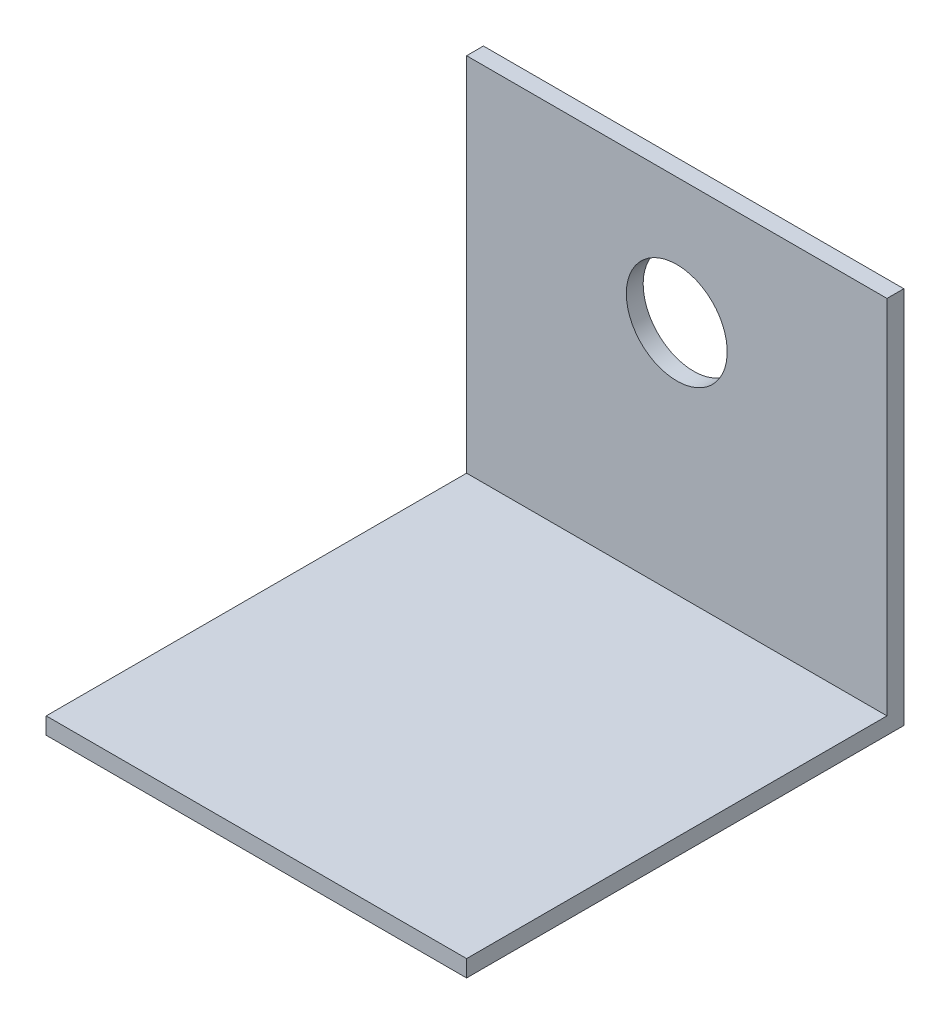
ISO-10303-21;
HEADER;
FILE_DESCRIPTION(('STEP AP214'),'2;1');
FILE_NAME('part.step','',(''),(''),'','','');
FILE_SCHEMA(('AUTOMOTIVE_DESIGN { 1 0 10303 214 1 1 1 1 }'));
ENDSEC;
DATA;
#1=APPLICATION_CONTEXT('core data for automotive mechanical design processes');
#2=APPLICATION_PROTOCOL_DEFINITION('international standard','automotive_design',2000,#1);
#3=PRODUCT_CONTEXT('',#1,'mechanical');
#4=PRODUCT('Part','Part','',(#3));
#5=PRODUCT_RELATED_PRODUCT_CATEGORY('part','',(#4));
#6=PRODUCT_DEFINITION_FORMATION('','',#4);
#7=PRODUCT_DEFINITION_CONTEXT('part definition',#1,'design');
#8=PRODUCT_DEFINITION('design','',#6,#7);
#9=PRODUCT_DEFINITION_SHAPE('','',#8);
#10=(LENGTH_UNIT() NAMED_UNIT(*) SI_UNIT(.MILLI.,.METRE.));
#11=(NAMED_UNIT(*) PLANE_ANGLE_UNIT() SI_UNIT($,.RADIAN.));
#12=(NAMED_UNIT(*) SI_UNIT($,.STERADIAN.) SOLID_ANGLE_UNIT());
#13=UNCERTAINTY_MEASURE_WITH_UNIT(LENGTH_MEASURE(1.E-05),#10,'distance_accuracy_value','');
#14=(GEOMETRIC_REPRESENTATION_CONTEXT(3) GLOBAL_UNCERTAINTY_ASSIGNED_CONTEXT((#13)) GLOBAL_UNIT_ASSIGNED_CONTEXT((#10,
#11,#12)) REPRESENTATION_CONTEXT('',''));
#15=CARTESIAN_POINT('',(0.,0.,0.));
#16=DIRECTION('',(0.,0.,1.));
#17=DIRECTION('',(1.,0.,0.));
#18=AXIS2_PLACEMENT_3D('',#15,#16,#17);
#19=CARTESIAN_POINT('',(0.,2.,0.));
#20=DIRECTION('',(1.,0.,0.));
#21=DIRECTION('',(0.,0.,-1.));
#22=AXIS2_PLACEMENT_3D('',#19,#20,#21);
#23=PLANE('',#22);
#24=DIRECTION('',(0.,0.,1.));
#25=VECTOR('',#24,1.);
#26=CARTESIAN_POINT('',(0.,0.,0.));
#27=LINE('',#26,#25);
#28=CARTESIAN_POINT('',(0.,0.,-2.));
#29=VERTEX_POINT('',#28);
#30=CARTESIAN_POINT('',(0.,0.,50.));
#31=VERTEX_POINT('',#30);
#32=EDGE_CURVE('E94',#29,#31,#27,.T.);
#33=ORIENTED_EDGE('',*,*,#32,.T.);
#34=DIRECTION('',(0.,-1.,0.));
#35=VECTOR('',#34,1.);
#36=CARTESIAN_POINT('',(0.,2.,50.));
#37=LINE('',#36,#35);
#38=CARTESIAN_POINT('',(0.,2.,50.));
#39=VERTEX_POINT('',#38);
#40=EDGE_CURVE('E11',#39,#31,#37,.T.);
#41=ORIENTED_EDGE('',*,*,#40,.F.);
#42=DIRECTION('',(0.,0.,1.));
#43=VECTOR('',#42,1.);
#44=CARTESIAN_POINT('',(0.,2.,0.));
#45=LINE('',#44,#43);
#46=CARTESIAN_POINT('',(0.,2.,0.));
#47=VERTEX_POINT('',#46);
#48=EDGE_CURVE('E86',#47,#39,#45,.T.);
#49=ORIENTED_EDGE('',*,*,#48,.F.);
#50=DIRECTION('',(0.,1.,0.));
#51=VECTOR('',#50,1.);
#52=CARTESIAN_POINT('',(0.,0.,0.));
#53=LINE('',#52,#51);
#54=CARTESIAN_POINT('',(0.,45.,0.));
#55=VERTEX_POINT('',#54);
#56=EDGE_CURVE('E48',#47,#55,#53,.T.);
#57=ORIENTED_EDGE('',*,*,#56,.T.);
#58=DIRECTION('',(0.,0.,1.));
#59=VECTOR('',#58,1.);
#60=CARTESIAN_POINT('',(0.,45.,-2.));
#61=LINE('',#60,#59);
#62=CARTESIAN_POINT('',(0.,45.,-2.));
#63=VERTEX_POINT('',#62);
#64=EDGE_CURVE('E101',#63,#55,#61,.T.);
#65=ORIENTED_EDGE('',*,*,#64,.F.);
#66=DIRECTION('',(0.,1.,0.));
#67=VECTOR('',#66,1.);
#68=CARTESIAN_POINT('',(0.,0.,-2.));
#69=LINE('',#68,#67);
#70=EDGE_CURVE('E98',#29,#63,#69,.T.);
#71=ORIENTED_EDGE('',*,*,#70,.F.);
#72=EDGE_LOOP('',(#33,#41,#49,#57,#65,#71));
#73=FACE_BOUND('',#72,.T.);
#74=ADVANCED_FACE('F32',(#73),#23,.F.);
#75=CARTESIAN_POINT('',(0.,2.,50.));
#76=DIRECTION('',(0.,0.,-1.));
#77=DIRECTION('',(-1.,0.,0.));
#78=AXIS2_PLACEMENT_3D('',#75,#76,#77);
#79=PLANE('',#78);
#80=DIRECTION('',(1.,0.,0.));
#81=VECTOR('',#80,1.);
#82=CARTESIAN_POINT('',(0.,0.,50.));
#83=LINE('',#82,#81);
#84=CARTESIAN_POINT('',(50.,0.,50.));
#85=VERTEX_POINT('',#84);
#86=EDGE_CURVE('E61',#31,#85,#83,.T.);
#87=ORIENTED_EDGE('',*,*,#86,.T.);
#88=DIRECTION('',(0.,-1.,0.));
#89=VECTOR('',#88,1.);
#90=CARTESIAN_POINT('',(50.,2.,50.));
#91=LINE('',#90,#89);
#92=CARTESIAN_POINT('',(50.,2.,50.));
#93=VERTEX_POINT('',#92);
#94=EDGE_CURVE('E40',#93,#85,#91,.T.);
#95=ORIENTED_EDGE('',*,*,#94,.F.);
#96=DIRECTION('',(1.,0.,0.));
#97=VECTOR('',#96,1.);
#98=CARTESIAN_POINT('',(0.,2.,50.));
#99=LINE('',#98,#97);
#100=EDGE_CURVE('E76',#39,#93,#99,.T.);
#101=ORIENTED_EDGE('',*,*,#100,.F.);
#102=ORIENTED_EDGE('',*,*,#40,.T.);
#103=EDGE_LOOP('',(#87,#95,#101,#102));
#104=FACE_BOUND('',#103,.T.);
#105=ADVANCED_FACE('F78',(#104),#79,.F.);
#106=CARTESIAN_POINT('',(50.,2.,0.));
#107=DIRECTION('',(-1.,0.,0.));
#108=DIRECTION('',(0.,0.,1.));
#109=AXIS2_PLACEMENT_3D('',#106,#107,#108);
#110=PLANE('',#109);
#111=DIRECTION('',(0.,0.,-1.));
#112=VECTOR('',#111,1.);
#113=CARTESIAN_POINT('',(50.,0.,0.));
#114=LINE('',#113,#112);
#115=CARTESIAN_POINT('',(50.,0.,-2.));
#116=VERTEX_POINT('',#115);
#117=EDGE_CURVE('E91',#85,#116,#114,.T.);
#118=ORIENTED_EDGE('',*,*,#117,.T.);
#119=DIRECTION('',(0.,-1.,0.));
#120=VECTOR('',#119,1.);
#121=CARTESIAN_POINT('',(50.,0.,-2.));
#122=LINE('',#121,#120);
#123=CARTESIAN_POINT('',(50.,45.,-2.));
#124=VERTEX_POINT('',#123);
#125=EDGE_CURVE('E119',#124,#116,#122,.T.);
#126=ORIENTED_EDGE('',*,*,#125,.F.);
#127=DIRECTION('',(0.,0.,1.));
#128=VECTOR('',#127,1.);
#129=CARTESIAN_POINT('',(50.,45.,-2.));
#130=LINE('',#129,#128);
#131=CARTESIAN_POINT('',(50.,45.,0.));
#132=VERTEX_POINT('',#131);
#133=EDGE_CURVE('E105',#124,#132,#130,.T.);
#134=ORIENTED_EDGE('',*,*,#133,.T.);
#135=DIRECTION('',(0.,-1.,0.));
#136=VECTOR('',#135,1.);
#137=CARTESIAN_POINT('',(50.,0.,0.));
#138=LINE('',#137,#136);
#139=CARTESIAN_POINT('',(50.,2.,0.));
#140=VERTEX_POINT('',#139);
#141=EDGE_CURVE('E121',#132,#140,#138,.T.);
#142=ORIENTED_EDGE('',*,*,#141,.T.);
#143=DIRECTION('',(0.,0.,-1.));
#144=VECTOR('',#143,1.);
#145=CARTESIAN_POINT('',(50.,2.,0.));
#146=LINE('',#145,#144);
#147=EDGE_CURVE('E85',#93,#140,#146,.T.);
#148=ORIENTED_EDGE('',*,*,#147,.F.);
#149=ORIENTED_EDGE('',*,*,#94,.T.);
#150=EDGE_LOOP('',(#118,#126,#134,#142,#148,#149));
#151=FACE_BOUND('',#150,.T.);
#152=ADVANCED_FACE('F159',(#151),#110,.F.);
#153=CARTESIAN_POINT('',(0.,2.,0.));
#154=DIRECTION('',(0.,1.,0.));
#155=DIRECTION('',(0.,0.,1.));
#156=AXIS2_PLACEMENT_3D('',#153,#154,#155);
#157=PLANE('',#156);
#158=ORIENTED_EDGE('',*,*,#48,.T.);
#159=ORIENTED_EDGE('',*,*,#100,.T.);
#160=ORIENTED_EDGE('',*,*,#147,.T.);
#161=DIRECTION('',(-1.,0.,0.));
#162=VECTOR('',#161,1.);
#163=CARTESIAN_POINT('',(0.,2.,0.));
#164=LINE('',#163,#162);
#165=EDGE_CURVE('E65',#140,#47,#164,.T.);
#166=ORIENTED_EDGE('',*,*,#165,.T.);
#167=EDGE_LOOP('',(#158,#159,#160,#166));
#168=FACE_BOUND('',#167,.T.);
#169=ADVANCED_FACE('F89',(#168),#157,.T.);
#170=CARTESIAN_POINT('',(0.,0.,0.));
#171=DIRECTION('',(0.,1.,0.));
#172=DIRECTION('',(0.,0.,1.));
#173=AXIS2_PLACEMENT_3D('',#170,#171,#172);
#174=PLANE('',#173);
#175=ORIENTED_EDGE('',*,*,#32,.F.);
#176=DIRECTION('',(-1.,0.,0.));
#177=VECTOR('',#176,1.);
#178=CARTESIAN_POINT('',(50.,0.,-2.));
#179=LINE('',#178,#177);
#180=EDGE_CURVE('E126',#116,#29,#179,.T.);
#181=ORIENTED_EDGE('',*,*,#180,.F.);
#182=ORIENTED_EDGE('',*,*,#117,.F.);
#183=ORIENTED_EDGE('',*,*,#86,.F.);
#184=EDGE_LOOP('',(#175,#181,#182,#183));
#185=FACE_BOUND('',#184,.T.);
#186=ADVANCED_FACE('F151',(#185),#174,.F.);
#187=CARTESIAN_POINT('',(0.,0.,0.));
#188=DIRECTION('',(0.,0.,1.));
#189=DIRECTION('',(1.,0.,0.));
#190=AXIS2_PLACEMENT_3D('',#187,#188,#189);
#191=PLANE('',#190);
#192=CARTESIAN_POINT('',(25.,30.,0.));
#193=DIRECTION('',(0.,0.,-1.));
#194=DIRECTION('',(-1.,0.,0.));
#195=AXIS2_PLACEMENT_3D('',#192,#193,#194);
#196=CIRCLE('',#195,6.);
#197=CARTESIAN_POINT('',(19.,30.,0.));
#198=VERTEX_POINT('',#197);
#199=EDGE_CURVE('E130',#198,#198,#196,.T.);
#200=ORIENTED_EDGE('',*,*,#199,.T.);
#201=EDGE_LOOP('',(#200));
#202=FACE_BOUND('',#201,.T.);
#203=ORIENTED_EDGE('',*,*,#165,.F.);
#204=ORIENTED_EDGE('',*,*,#141,.F.);
#205=DIRECTION('',(1.,0.,0.));
#206=VECTOR('',#205,1.);
#207=CARTESIAN_POINT('',(50.,45.,0.));
#208=LINE('',#207,#206);
#209=EDGE_CURVE('E116',#55,#132,#208,.T.);
#210=ORIENTED_EDGE('',*,*,#209,.F.);
#211=ORIENTED_EDGE('',*,*,#56,.F.);
#212=EDGE_LOOP('',(#203,#204,#210,#211));
#213=FACE_BOUND('',#212,.T.);
#214=ADVANCED_FACE('F142',(#202,#213),#191,.T.);
#215=CARTESIAN_POINT('',(0.,0.,-2.));
#216=DIRECTION('',(0.,0.,1.));
#217=DIRECTION('',(1.,0.,0.));
#218=AXIS2_PLACEMENT_3D('',#215,#216,#217);
#219=PLANE('',#218);
#220=ORIENTED_EDGE('',*,*,#125,.T.);
#221=ORIENTED_EDGE('',*,*,#180,.T.);
#222=ORIENTED_EDGE('',*,*,#70,.T.);
#223=DIRECTION('',(1.,0.,0.));
#224=VECTOR('',#223,1.);
#225=CARTESIAN_POINT('',(50.,45.,-2.));
#226=LINE('',#225,#224);
#227=EDGE_CURVE('E115',#63,#124,#226,.T.);
#228=ORIENTED_EDGE('',*,*,#227,.T.);
#229=EDGE_LOOP('',(#220,#221,#222,#228));
#230=FACE_BOUND('',#229,.T.);
#231=CARTESIAN_POINT('',(25.,30.,-2.));
#232=DIRECTION('',(0.,0.,-1.));
#233=DIRECTION('',(-1.,0.,0.));
#234=AXIS2_PLACEMENT_3D('',#231,#232,#233);
#235=CIRCLE('',#234,6.);
#236=CARTESIAN_POINT('',(19.,30.,-2.));
#237=VERTEX_POINT('',#236);
#238=EDGE_CURVE('E123',#237,#237,#235,.T.);
#239=ORIENTED_EDGE('',*,*,#238,.F.);
#240=EDGE_LOOP('',(#239));
#241=FACE_BOUND('',#240,.T.);
#242=ADVANCED_FACE('F139',(#230,#241),#219,.F.);
#243=CARTESIAN_POINT('',(50.,45.,-2.));
#244=DIRECTION('',(0.,-1.,0.));
#245=DIRECTION('',(1.,0.,0.));
#246=AXIS2_PLACEMENT_3D('',#243,#244,#245);
#247=PLANE('',#246);
#248=ORIENTED_EDGE('',*,*,#209,.T.);
#249=ORIENTED_EDGE('',*,*,#133,.F.);
#250=ORIENTED_EDGE('',*,*,#227,.F.);
#251=ORIENTED_EDGE('',*,*,#64,.T.);
#252=EDGE_LOOP('',(#248,#249,#250,#251));
#253=FACE_BOUND('',#252,.T.);
#254=ADVANCED_FACE('F141',(#253),#247,.F.);
#255=CARTESIAN_POINT('',(25.,30.,-2.));
#256=DIRECTION('',(0.,0.,1.));
#257=DIRECTION('',(1.,0.,0.));
#258=AXIS2_PLACEMENT_3D('',#255,#256,#257);
#259=CYLINDRICAL_SURFACE('',#258,6.);
#260=ORIENTED_EDGE('',*,*,#238,.T.);
#261=EDGE_LOOP('',(#260));
#262=FACE_BOUND('',#261,.T.);
#263=ORIENTED_EDGE('',*,*,#199,.F.);
#264=EDGE_LOOP('',(#263));
#265=FACE_BOUND('',#264,.T.);
#266=ADVANCED_FACE('F136',(#262,#265),#259,.F.);
#267=CLOSED_SHELL('',(#74,#105,#152,#169,#186,#214,#242,#254,#266));
#268=MANIFOLD_SOLID_BREP('B2',#267);
#269=ADVANCED_BREP_SHAPE_REPRESENTATION('',(#18,#268),#14);
#270=SHAPE_DEFINITION_REPRESENTATION(#9,#269);
ENDSEC;
END-ISO-10303-21;
